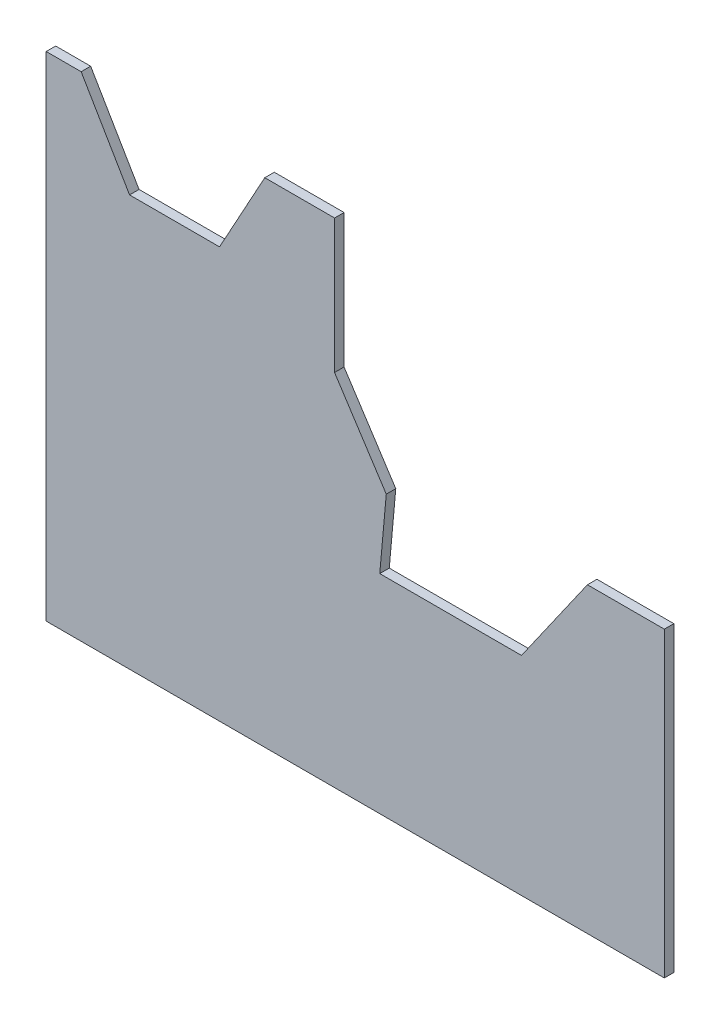
ISO-10303-21;
HEADER;
FILE_DESCRIPTION(('STEP AP214'),'2;1');
FILE_NAME('part.step','',(''),(''),'','','');
FILE_SCHEMA(('AUTOMOTIVE_DESIGN { 1 0 10303 214 1 1 1 1 }'));
ENDSEC;
DATA;
#1=APPLICATION_CONTEXT('core data for automotive mechanical design processes');
#2=APPLICATION_PROTOCOL_DEFINITION('international standard','automotive_design',2000,#1);
#3=PRODUCT_CONTEXT('',#1,'mechanical');
#4=PRODUCT('Part','Part','',(#3));
#5=PRODUCT_RELATED_PRODUCT_CATEGORY('part','',(#4));
#6=PRODUCT_DEFINITION_FORMATION('','',#4);
#7=PRODUCT_DEFINITION_CONTEXT('part definition',#1,'design');
#8=PRODUCT_DEFINITION('design','',#6,#7);
#9=PRODUCT_DEFINITION_SHAPE('','',#8);
#10=(LENGTH_UNIT() NAMED_UNIT(*) SI_UNIT(.MILLI.,.METRE.));
#11=(NAMED_UNIT(*) PLANE_ANGLE_UNIT() SI_UNIT($,.RADIAN.));
#12=(NAMED_UNIT(*) SI_UNIT($,.STERADIAN.) SOLID_ANGLE_UNIT());
#13=UNCERTAINTY_MEASURE_WITH_UNIT(LENGTH_MEASURE(1.E-05),#10,'distance_accuracy_value','');
#14=(GEOMETRIC_REPRESENTATION_CONTEXT(3) GLOBAL_UNCERTAINTY_ASSIGNED_CONTEXT((#13)) GLOBAL_UNIT_ASSIGNED_CONTEXT((#10,
#11,#12)) REPRESENTATION_CONTEXT('',''));
#15=CARTESIAN_POINT('',(0.,0.,0.));
#16=DIRECTION('',(0.,0.,1.));
#17=DIRECTION('',(1.,0.,0.));
#18=AXIS2_PLACEMENT_3D('',#15,#16,#17);
#19=CARTESIAN_POINT('',(11.279813794132,-8.08298090293379,0.8));
#20=DIRECTION('',(-1.,0.,0.));
#21=DIRECTION('',(0.,-1.,0.));
#22=AXIS2_PLACEMENT_3D('',#19,#20,#21);
#23=PLANE('',#22);
#24=DIRECTION('',(0.,1.,0.));
#25=VECTOR('',#24,1.);
#26=CARTESIAN_POINT('',(11.279813794132,-8.08298090293379,0.));
#27=LINE('',#26,#25);
#28=CARTESIAN_POINT('',(11.279813794132,-33.4999999999999,0.));
#29=VERTEX_POINT('',#28);
#30=CARTESIAN_POINT('',(11.279813794132,-8.08298090293379,0.));
#31=VERTEX_POINT('',#30);
#32=EDGE_CURVE('E165',#29,#31,#27,.T.);
#33=ORIENTED_EDGE('',*,*,#32,.T.);
#34=DIRECTION('',(0.,0.,-1.));
#35=VECTOR('',#34,1.);
#36=CARTESIAN_POINT('',(11.279813794132,-8.08298090293379,0.8));
#37=LINE('',#36,#35);
#38=CARTESIAN_POINT('',(11.279813794132,-8.08298090293379,0.8));
#39=VERTEX_POINT('',#38);
#40=EDGE_CURVE('E11',#39,#31,#37,.T.);
#41=ORIENTED_EDGE('',*,*,#40,.F.);
#42=DIRECTION('',(0.,1.,0.));
#43=VECTOR('',#42,1.);
#44=CARTESIAN_POINT('',(11.279813794132,-8.08298090293379,0.8));
#45=LINE('',#44,#43);
#46=CARTESIAN_POINT('',(11.279813794132,-33.4999999999999,0.8));
#47=VERTEX_POINT('',#46);
#48=EDGE_CURVE('E191',#47,#39,#45,.T.);
#49=ORIENTED_EDGE('',*,*,#48,.F.);
#50=DIRECTION('',(0.,0.,-1.));
#51=VECTOR('',#50,1.);
#52=CARTESIAN_POINT('',(11.279813794132,-33.4999999999999,0.8));
#53=LINE('',#52,#51);
#54=EDGE_CURVE('E161',#47,#29,#53,.T.);
#55=ORIENTED_EDGE('',*,*,#54,.T.);
#56=EDGE_LOOP('',(#33,#41,#49,#55));
#57=FACE_BOUND('',#56,.T.);
#58=ADVANCED_FACE('F33',(#57),#23,.F.);
#59=CARTESIAN_POINT('',(11.279813794132,-8.08298090293379,0.8));
#60=DIRECTION('',(0.,-1.,0.));
#61=DIRECTION('',(0.,0.,-1.));
#62=AXIS2_PLACEMENT_3D('',#59,#60,#61);
#63=PLANE('',#62);
#64=DIRECTION('',(-1.,0.,0.));
#65=VECTOR('',#64,1.);
#66=CARTESIAN_POINT('',(11.279813794132,-8.08298090293379,0.));
#67=LINE('',#66,#65);
#68=CARTESIAN_POINT('',(4.81300376005132,-8.08298090293379,0.));
#69=VERTEX_POINT('',#68);
#70=EDGE_CURVE('E168',#31,#69,#67,.T.);
#71=ORIENTED_EDGE('',*,*,#70,.T.);
#72=DIRECTION('',(0.,0.,-1.));
#73=VECTOR('',#72,1.);
#74=CARTESIAN_POINT('',(4.81300376005132,-8.08298090293379,0.8));
#75=LINE('',#74,#73);
#76=CARTESIAN_POINT('',(4.81300376005132,-8.08298090293379,0.8));
#77=VERTEX_POINT('',#76);
#78=EDGE_CURVE('E41',#77,#69,#75,.T.);
#79=ORIENTED_EDGE('',*,*,#78,.F.);
#80=DIRECTION('',(-1.,0.,0.));
#81=VECTOR('',#80,1.);
#82=CARTESIAN_POINT('',(11.279813794132,-8.08298090293379,0.8));
#83=LINE('',#82,#81);
#84=EDGE_CURVE('E110',#39,#77,#83,.T.);
#85=ORIENTED_EDGE('',*,*,#84,.F.);
#86=ORIENTED_EDGE('',*,*,#40,.T.);
#87=EDGE_LOOP('',(#71,#79,#85,#86));
#88=FACE_BOUND('',#87,.T.);
#89=ADVANCED_FACE('F279',(#88),#63,.F.);
#90=CARTESIAN_POINT('',(4.81300376005132,-8.08298090293379,0.8));
#91=DIRECTION('',(0.819152044288993,-0.573576436351044,0.));
#92=DIRECTION('',(0.573576436351044,0.819152044288993,0.));
#93=AXIS2_PLACEMENT_3D('',#90,#91,#92);
#94=PLANE('',#93);
#95=DIRECTION('',(-0.573576436351044,-0.819152044288993,0.));
#96=VECTOR('',#95,1.);
#97=CARTESIAN_POINT('',(4.81300376005132,-8.08298090293379,0.));
#98=LINE('',#97,#96);
#99=CARTESIAN_POINT('',(-0.734771551991552,-16.006025156681,0.));
#100=VERTEX_POINT('',#99);
#101=EDGE_CURVE('E170',#69,#100,#98,.T.);
#102=ORIENTED_EDGE('',*,*,#101,.T.);
#103=DIRECTION('',(0.,0.,-1.));
#104=VECTOR('',#103,1.);
#105=CARTESIAN_POINT('',(-0.734771551991552,-16.006025156681,0.8));
#106=LINE('',#105,#104);
#107=CARTESIAN_POINT('',(-0.734771551991552,-16.006025156681,0.8));
#108=VERTEX_POINT('',#107);
#109=EDGE_CURVE('E216',#108,#100,#106,.T.);
#110=ORIENTED_EDGE('',*,*,#109,.F.);
#111=DIRECTION('',(-0.573576436351044,-0.819152044288993,0.));
#112=VECTOR('',#111,1.);
#113=CARTESIAN_POINT('',(4.81300376005132,-8.08298090293379,0.8));
#114=LINE('',#113,#112);
#115=EDGE_CURVE('E224',#77,#108,#114,.T.);
#116=ORIENTED_EDGE('',*,*,#115,.F.);
#117=ORIENTED_EDGE('',*,*,#78,.T.);
#118=EDGE_LOOP('',(#102,#110,#116,#117));
#119=FACE_BOUND('',#118,.T.);
#120=ADVANCED_FACE('F222',(#119),#94,.F.);
#121=CARTESIAN_POINT('',(-0.734771551991552,-16.006025156681,0.8));
#122=DIRECTION('',(0.,-1.,0.));
#123=DIRECTION('',(0.,0.,-1.));
#124=AXIS2_PLACEMENT_3D('',#121,#122,#123);
#125=PLANE('',#124);
#126=DIRECTION('',(-1.,0.,0.));
#127=VECTOR('',#126,1.);
#128=CARTESIAN_POINT('',(-0.734771551991552,-16.006025156681,0.));
#129=LINE('',#128,#127);
#130=CARTESIAN_POINT('',(-12.65766773392,-16.006025156681,0.));
#131=VERTEX_POINT('',#130);
#132=EDGE_CURVE('E172',#100,#131,#129,.T.);
#133=ORIENTED_EDGE('',*,*,#132,.T.);
#134=DIRECTION('',(0.,0.,-1.));
#135=VECTOR('',#134,1.);
#136=CARTESIAN_POINT('',(-12.65766773392,-16.006025156681,0.8));
#137=LINE('',#136,#135);
#138=CARTESIAN_POINT('',(-12.65766773392,-16.006025156681,0.8));
#139=VERTEX_POINT('',#138);
#140=EDGE_CURVE('E213',#139,#131,#137,.T.);
#141=ORIENTED_EDGE('',*,*,#140,.F.);
#142=DIRECTION('',(-1.,0.,0.));
#143=VECTOR('',#142,1.);
#144=CARTESIAN_POINT('',(-0.734771551991552,-16.006025156681,0.8));
#145=LINE('',#144,#143);
#146=EDGE_CURVE('E242',#108,#139,#145,.T.);
#147=ORIENTED_EDGE('',*,*,#146,.F.);
#148=ORIENTED_EDGE('',*,*,#109,.T.);
#149=EDGE_LOOP('',(#133,#141,#147,#148));
#150=FACE_BOUND('',#149,.T.);
#151=ADVANCED_FACE('F233',(#150),#125,.F.);
#152=CARTESIAN_POINT('',(-12.65766773392,-16.006025156681,0.8));
#153=DIRECTION('',(-0.995953430498841,0.0898708199450178,0.));
#154=DIRECTION('',(-0.0898708199450178,-0.995953430498841,0.));
#155=AXIS2_PLACEMENT_3D('',#152,#153,#154);
#156=PLANE('',#155);
#157=DIRECTION('',(0.0898708199450178,0.995953430498841,0.));
#158=VECTOR('',#157,1.);
#159=CARTESIAN_POINT('',(-12.65766773392,-16.006025156681,0.));
#160=LINE('',#159,#158);
#161=CARTESIAN_POINT('',(-12.1107283955804,-9.94481295646505,0.));
#162=VERTEX_POINT('',#161);
#163=EDGE_CURVE('E174',#131,#162,#160,.T.);
#164=ORIENTED_EDGE('',*,*,#163,.T.);
#165=DIRECTION('',(0.,0.,-1.));
#166=VECTOR('',#165,1.);
#167=CARTESIAN_POINT('',(-12.1107283955804,-9.94481295646505,0.8));
#168=LINE('',#167,#166);
#169=CARTESIAN_POINT('',(-12.1107283955804,-9.94481295646505,0.8));
#170=VERTEX_POINT('',#169);
#171=EDGE_CURVE('E210',#170,#162,#168,.T.);
#172=ORIENTED_EDGE('',*,*,#171,.F.);
#173=DIRECTION('',(0.0898708199450178,0.995953430498841,0.));
#174=VECTOR('',#173,1.);
#175=CARTESIAN_POINT('',(-12.65766773392,-16.006025156681,0.8));
#176=LINE('',#175,#174);
#177=EDGE_CURVE('E239',#139,#170,#176,.T.);
#178=ORIENTED_EDGE('',*,*,#177,.F.);
#179=ORIENTED_EDGE('',*,*,#140,.T.);
#180=EDGE_LOOP('',(#164,#172,#178,#179));
#181=FACE_BOUND('',#180,.T.);
#182=ADVANCED_FACE('F237',(#181),#156,.F.);
#183=CARTESIAN_POINT('',(-12.1107283955804,-9.94481295646505,0.8));
#184=DIRECTION('',(-0.838396358507799,-0.5450610479945,0.));
#185=DIRECTION('',(0.5450610479945,-0.838396358507799,0.));
#186=AXIS2_PLACEMENT_3D('',#183,#184,#185);
#187=PLANE('',#186);
#188=DIRECTION('',(-0.5450610479945,0.838396358507799,0.));
#189=VECTOR('',#188,1.);
#190=CARTESIAN_POINT('',(-12.1107283955804,-9.94481295646505,0.));
#191=LINE('',#190,#189);
#192=CARTESIAN_POINT('',(-16.4603449286848,-3.25436483936376,0.));
#193=VERTEX_POINT('',#192);
#194=EDGE_CURVE('E176',#162,#193,#191,.T.);
#195=ORIENTED_EDGE('',*,*,#194,.T.);
#196=DIRECTION('',(0.,0.,-1.));
#197=VECTOR('',#196,1.);
#198=CARTESIAN_POINT('',(-16.4603449286848,-3.25436483936376,0.8));
#199=LINE('',#198,#197);
#200=CARTESIAN_POINT('',(-16.4603449286848,-3.25436483936376,0.8));
#201=VERTEX_POINT('',#200);
#202=EDGE_CURVE('E207',#201,#193,#199,.T.);
#203=ORIENTED_EDGE('',*,*,#202,.F.);
#204=DIRECTION('',(-0.5450610479945,0.838396358507799,0.));
#205=VECTOR('',#204,1.);
#206=CARTESIAN_POINT('',(-12.1107283955804,-9.94481295646505,0.8));
#207=LINE('',#206,#205);
#208=EDGE_CURVE('E241',#170,#201,#207,.T.);
#209=ORIENTED_EDGE('',*,*,#208,.F.);
#210=ORIENTED_EDGE('',*,*,#171,.T.);
#211=EDGE_LOOP('',(#195,#203,#209,#210));
#212=FACE_BOUND('',#211,.T.);
#213=ADVANCED_FACE('F292',(#212),#187,.F.);
#214=CARTESIAN_POINT('',(-16.4603449286848,-3.25436483936376,0.8));
#215=DIRECTION('',(-1.,0.,0.));
#216=DIRECTION('',(0.,0.,1.));
#217=AXIS2_PLACEMENT_3D('',#214,#215,#216);
#218=PLANE('',#217);
#219=DIRECTION('',(0.,1.,0.));
#220=VECTOR('',#219,1.);
#221=CARTESIAN_POINT('',(-16.4603449286848,-3.25436483936376,0.));
#222=LINE('',#221,#220);
#223=CARTESIAN_POINT('',(-16.4603449286848,8.00075560650966,0.));
#224=VERTEX_POINT('',#223);
#225=EDGE_CURVE('E178',#193,#224,#222,.T.);
#226=ORIENTED_EDGE('',*,*,#225,.T.);
#227=DIRECTION('',(0.,0.,-1.));
#228=VECTOR('',#227,1.);
#229=CARTESIAN_POINT('',(-16.4603449286848,8.00075560650966,0.8));
#230=LINE('',#229,#228);
#231=CARTESIAN_POINT('',(-16.4603449286848,8.00075560650966,0.8));
#232=VERTEX_POINT('',#231);
#233=EDGE_CURVE('E204',#232,#224,#230,.T.);
#234=ORIENTED_EDGE('',*,*,#233,.F.);
#235=DIRECTION('',(0.,1.,0.));
#236=VECTOR('',#235,1.);
#237=CARTESIAN_POINT('',(-16.4603449286848,-3.25436483936376,0.8));
#238=LINE('',#237,#236);
#239=EDGE_CURVE('E244',#201,#232,#238,.T.);
#240=ORIENTED_EDGE('',*,*,#239,.F.);
#241=ORIENTED_EDGE('',*,*,#202,.T.);
#242=EDGE_LOOP('',(#226,#234,#240,#241));
#243=FACE_BOUND('',#242,.T.);
#244=ADVANCED_FACE('F295',(#243),#218,.F.);
#245=CARTESIAN_POINT('',(-16.4603449286848,8.00075560650966,0.8));
#246=DIRECTION('',(0.,-1.,0.));
#247=DIRECTION('',(0.,0.,-1.));
#248=AXIS2_PLACEMENT_3D('',#245,#246,#247);
#249=PLANE('',#248);
#250=DIRECTION('',(-1.,0.,0.));
#251=VECTOR('',#250,1.);
#252=CARTESIAN_POINT('',(-16.4603449286848,8.00075560650966,0.));
#253=LINE('',#252,#251);
#254=CARTESIAN_POINT('',(-22.3305238409462,8.00075560650966,0.));
#255=VERTEX_POINT('',#254);
#256=EDGE_CURVE('E180',#224,#255,#253,.T.);
#257=ORIENTED_EDGE('',*,*,#256,.T.);
#258=DIRECTION('',(0.,0.,-1.));
#259=VECTOR('',#258,1.);
#260=CARTESIAN_POINT('',(-22.3305238409462,8.00075560650966,0.8));
#261=LINE('',#260,#259);
#262=CARTESIAN_POINT('',(-22.3305238409462,8.00075560650966,0.8));
#263=VERTEX_POINT('',#262);
#264=EDGE_CURVE('E201',#263,#255,#261,.T.);
#265=ORIENTED_EDGE('',*,*,#264,.F.);
#266=DIRECTION('',(-1.,0.,0.));
#267=VECTOR('',#266,1.);
#268=CARTESIAN_POINT('',(-16.4603449286848,8.00075560650966,0.8));
#269=LINE('',#268,#267);
#270=EDGE_CURVE('E250',#232,#263,#269,.T.);
#271=ORIENTED_EDGE('',*,*,#270,.F.);
#272=ORIENTED_EDGE('',*,*,#233,.T.);
#273=EDGE_LOOP('',(#257,#265,#271,#272));
#274=FACE_BOUND('',#273,.T.);
#275=ADVANCED_FACE('F299',(#274),#249,.F.);
#276=CARTESIAN_POINT('',(-22.3305238409462,8.00075560650966,0.8));
#277=DIRECTION('',(0.876858448183733,-0.480748647266757,0.));
#278=DIRECTION('',(0.480748647266757,0.876858448183733,0.));
#279=AXIS2_PLACEMENT_3D('',#276,#277,#278);
#280=PLANE('',#279);
#281=DIRECTION('',(-0.480748647266757,-0.876858448183733,0.));
#282=VECTOR('',#281,1.);
#283=CARTESIAN_POINT('',(-22.3305238409462,8.00075560650966,0.));
#284=LINE('',#283,#282);
#285=CARTESIAN_POINT('',(-26.1366473013426,1.05860084423724,0.));
#286=VERTEX_POINT('',#285);
#287=EDGE_CURVE('E182',#255,#286,#284,.T.);
#288=ORIENTED_EDGE('',*,*,#287,.T.);
#289=DIRECTION('',(0.,0.,-1.));
#290=VECTOR('',#289,1.);
#291=CARTESIAN_POINT('',(-26.1366473013426,1.05860084423724,0.8));
#292=LINE('',#291,#290);
#293=CARTESIAN_POINT('',(-26.1366473013426,1.05860084423724,0.8));
#294=VERTEX_POINT('',#293);
#295=EDGE_CURVE('E198',#294,#286,#292,.T.);
#296=ORIENTED_EDGE('',*,*,#295,.F.);
#297=DIRECTION('',(-0.480748647266757,-0.876858448183733,0.));
#298=VECTOR('',#297,1.);
#299=CARTESIAN_POINT('',(-22.3305238409462,8.00075560650966,0.8));
#300=LINE('',#299,#298);
#301=EDGE_CURVE('E252',#263,#294,#300,.T.);
#302=ORIENTED_EDGE('',*,*,#301,.F.);
#303=ORIENTED_EDGE('',*,*,#264,.T.);
#304=EDGE_LOOP('',(#288,#296,#302,#303));
#305=FACE_BOUND('',#304,.T.);
#306=ADVANCED_FACE('F303',(#305),#280,.F.);
#307=CARTESIAN_POINT('',(-26.1366473013426,1.05860084423724,0.8));
#308=DIRECTION('',(0.,-1.,0.));
#309=DIRECTION('',(0.,0.,-1.));
#310=AXIS2_PLACEMENT_3D('',#307,#308,#309);
#311=PLANE('',#310);
#312=DIRECTION('',(-1.,0.,0.));
#313=VECTOR('',#312,1.);
#314=CARTESIAN_POINT('',(-26.1366473013426,1.05860084423724,0.));
#315=LINE('',#314,#313);
#316=CARTESIAN_POINT('',(-33.7070275728679,1.05860084423724,0.));
#317=VERTEX_POINT('',#316);
#318=EDGE_CURVE('E184',#286,#317,#315,.T.);
#319=ORIENTED_EDGE('',*,*,#318,.T.);
#320=DIRECTION('',(0.,0.,-1.));
#321=VECTOR('',#320,1.);
#322=CARTESIAN_POINT('',(-33.7070275728679,1.05860084423724,0.8));
#323=LINE('',#322,#321);
#324=CARTESIAN_POINT('',(-33.7070275728679,1.05860084423724,0.8));
#325=VERTEX_POINT('',#324);
#326=EDGE_CURVE('E195',#325,#317,#323,.T.);
#327=ORIENTED_EDGE('',*,*,#326,.F.);
#328=DIRECTION('',(-1.,0.,0.));
#329=VECTOR('',#328,1.);
#330=CARTESIAN_POINT('',(-26.1366473013426,1.05860084423724,0.8));
#331=LINE('',#330,#329);
#332=EDGE_CURVE('E254',#294,#325,#331,.T.);
#333=ORIENTED_EDGE('',*,*,#332,.F.);
#334=ORIENTED_EDGE('',*,*,#295,.T.);
#335=EDGE_LOOP('',(#319,#327,#333,#334));
#336=FACE_BOUND('',#335,.T.);
#337=ADVANCED_FACE('F260',(#336),#311,.F.);
#338=CARTESIAN_POINT('',(-33.7070275728679,1.05860084423724,0.8));
#339=DIRECTION('',(-0.862574753463412,-0.505929634126658,0.));
#340=DIRECTION('',(0.505929634126658,-0.862574753463412,0.));
#341=AXIS2_PLACEMENT_3D('',#338,#339,#340);
#342=PLANE('',#341);
#343=DIRECTION('',(-0.505929634126658,0.862574753463412,0.));
#344=VECTOR('',#343,1.);
#345=CARTESIAN_POINT('',(-33.7070275728679,1.05860084423724,0.));
#346=LINE('',#345,#344);
#347=CARTESIAN_POINT('',(-37.7788390939271,8.00075560650966,0.));
#348=VERTEX_POINT('',#347);
#349=EDGE_CURVE('E186',#317,#348,#346,.T.);
#350=ORIENTED_EDGE('',*,*,#349,.T.);
#351=DIRECTION('',(0.,0.,-1.));
#352=VECTOR('',#351,1.);
#353=CARTESIAN_POINT('',(-37.7788390939271,8.00075560650966,0.8));
#354=LINE('',#353,#352);
#355=CARTESIAN_POINT('',(-37.7788390939271,8.00075560650966,0.8));
#356=VERTEX_POINT('',#355);
#357=EDGE_CURVE('E156',#356,#348,#354,.T.);
#358=ORIENTED_EDGE('',*,*,#357,.F.);
#359=DIRECTION('',(-0.505929634126658,0.862574753463412,0.));
#360=VECTOR('',#359,1.);
#361=CARTESIAN_POINT('',(-33.7070275728679,1.05860084423724,0.8));
#362=LINE('',#361,#360);
#363=EDGE_CURVE('E147',#325,#356,#362,.T.);
#364=ORIENTED_EDGE('',*,*,#363,.F.);
#365=ORIENTED_EDGE('',*,*,#326,.T.);
#366=EDGE_LOOP('',(#350,#358,#364,#365));
#367=FACE_BOUND('',#366,.T.);
#368=ADVANCED_FACE('F264',(#367),#342,.F.);
#369=CARTESIAN_POINT('',(-37.7788390939271,8.00075560650966,0.8));
#370=DIRECTION('',(0.,-1.,0.));
#371=DIRECTION('',(0.,0.,-1.));
#372=AXIS2_PLACEMENT_3D('',#369,#370,#371);
#373=PLANE('',#372);
#374=DIRECTION('',(-1.,0.,0.));
#375=VECTOR('',#374,1.);
#376=CARTESIAN_POINT('',(-37.7788390939271,8.00075560650966,0.));
#377=LINE('',#376,#375);
#378=CARTESIAN_POINT('',(-40.720186205868,8.00075560650966,0.));
#379=VERTEX_POINT('',#378);
#380=EDGE_CURVE('E155',#348,#379,#377,.T.);
#381=ORIENTED_EDGE('',*,*,#380,.T.);
#382=DIRECTION('',(0.,0.,-1.));
#383=VECTOR('',#382,1.);
#384=CARTESIAN_POINT('',(-40.720186205868,8.00075560650966,0.8));
#385=LINE('',#384,#383);
#386=CARTESIAN_POINT('',(-40.720186205868,8.00075560650966,0.8));
#387=VERTEX_POINT('',#386);
#388=EDGE_CURVE('E152',#387,#379,#385,.T.);
#389=ORIENTED_EDGE('',*,*,#388,.F.);
#390=DIRECTION('',(-1.,0.,0.));
#391=VECTOR('',#390,1.);
#392=CARTESIAN_POINT('',(-37.7788390939271,8.00075560650966,0.8));
#393=LINE('',#392,#391);
#394=EDGE_CURVE('E141',#356,#387,#393,.T.);
#395=ORIENTED_EDGE('',*,*,#394,.F.);
#396=ORIENTED_EDGE('',*,*,#357,.T.);
#397=EDGE_LOOP('',(#381,#389,#395,#396));
#398=FACE_BOUND('',#397,.T.);
#399=ADVANCED_FACE('F153',(#398),#373,.F.);
#400=CARTESIAN_POINT('',(-40.720186205868,8.00075560650966,0.8));
#401=DIRECTION('',(1.,0.,0.));
#402=DIRECTION('',(0.,1.,0.));
#403=AXIS2_PLACEMENT_3D('',#400,#401,#402);
#404=PLANE('',#403);
#405=DIRECTION('',(0.,-1.,0.));
#406=VECTOR('',#405,1.);
#407=CARTESIAN_POINT('',(-40.720186205868,8.00075560650966,0.));
#408=LINE('',#407,#406);
#409=CARTESIAN_POINT('',(-40.720186205868,-33.4999999999999,0.));
#410=VERTEX_POINT('',#409);
#411=EDGE_CURVE('E96',#379,#410,#408,.T.);
#412=ORIENTED_EDGE('',*,*,#411,.T.);
#413=DIRECTION('',(0.,0.,-1.));
#414=VECTOR('',#413,1.);
#415=CARTESIAN_POINT('',(-40.720186205868,-33.4999999999999,0.8));
#416=LINE('',#415,#414);
#417=CARTESIAN_POINT('',(-40.720186205868,-33.4999999999999,0.8));
#418=VERTEX_POINT('',#417);
#419=EDGE_CURVE('E157',#418,#410,#416,.T.);
#420=ORIENTED_EDGE('',*,*,#419,.F.);
#421=DIRECTION('',(0.,-1.,0.));
#422=VECTOR('',#421,1.);
#423=CARTESIAN_POINT('',(-40.720186205868,8.00075560650966,0.8));
#424=LINE('',#423,#422);
#425=EDGE_CURVE('E145',#387,#418,#424,.T.);
#426=ORIENTED_EDGE('',*,*,#425,.F.);
#427=ORIENTED_EDGE('',*,*,#388,.T.);
#428=EDGE_LOOP('',(#412,#420,#426,#427));
#429=FACE_BOUND('',#428,.T.);
#430=ADVANCED_FACE('F159',(#429),#404,.F.);
#431=CARTESIAN_POINT('',(-40.720186205868,-33.4999999999999,0.8));
#432=DIRECTION('',(0.,1.,0.));
#433=DIRECTION('',(0.,0.,1.));
#434=AXIS2_PLACEMENT_3D('',#431,#432,#433);
#435=PLANE('',#434);
#436=DIRECTION('',(1.,0.,0.));
#437=VECTOR('',#436,1.);
#438=CARTESIAN_POINT('',(-40.720186205868,-33.4999999999999,0.));
#439=LINE('',#438,#437);
#440=EDGE_CURVE('E102',#410,#29,#439,.T.);
#441=ORIENTED_EDGE('',*,*,#440,.T.);
#442=ORIENTED_EDGE('',*,*,#54,.F.);
#443=DIRECTION('',(1.,0.,0.));
#444=VECTOR('',#443,1.);
#445=CARTESIAN_POINT('',(-40.720186205868,-33.4999999999999,0.8));
#446=LINE('',#445,#444);
#447=EDGE_CURVE('E49',#418,#47,#446,.T.);
#448=ORIENTED_EDGE('',*,*,#447,.F.);
#449=ORIENTED_EDGE('',*,*,#419,.T.);
#450=EDGE_LOOP('',(#441,#442,#448,#449));
#451=FACE_BOUND('',#450,.T.);
#452=ADVANCED_FACE('F268',(#451),#435,.F.);
#453=CARTESIAN_POINT('',(0.,0.,0.8));
#454=DIRECTION('',(0.,0.,1.));
#455=DIRECTION('',(1.,0.,0.));
#456=AXIS2_PLACEMENT_3D('',#453,#454,#455);
#457=PLANE('',#456);
#458=ORIENTED_EDGE('',*,*,#48,.T.);
#459=ORIENTED_EDGE('',*,*,#84,.T.);
#460=ORIENTED_EDGE('',*,*,#115,.T.);
#461=ORIENTED_EDGE('',*,*,#146,.T.);
#462=ORIENTED_EDGE('',*,*,#177,.T.);
#463=ORIENTED_EDGE('',*,*,#208,.T.);
#464=ORIENTED_EDGE('',*,*,#239,.T.);
#465=ORIENTED_EDGE('',*,*,#270,.T.);
#466=ORIENTED_EDGE('',*,*,#301,.T.);
#467=ORIENTED_EDGE('',*,*,#332,.T.);
#468=ORIENTED_EDGE('',*,*,#363,.T.);
#469=ORIENTED_EDGE('',*,*,#394,.T.);
#470=ORIENTED_EDGE('',*,*,#425,.T.);
#471=ORIENTED_EDGE('',*,*,#447,.T.);
#472=EDGE_LOOP('',(#458,#459,#460,#461,#462,#463,#464,#465,#466,#467,#468,#469,#470,#471));
#473=FACE_BOUND('',#472,.T.);
#474=ADVANCED_FACE('F143',(#473),#457,.T.);
#475=CARTESIAN_POINT('',(0.,0.,0.));
#476=DIRECTION('',(0.,0.,1.));
#477=DIRECTION('',(1.,0.,0.));
#478=AXIS2_PLACEMENT_3D('',#475,#476,#477);
#479=PLANE('',#478);
#480=ORIENTED_EDGE('',*,*,#32,.F.);
#481=ORIENTED_EDGE('',*,*,#440,.F.);
#482=ORIENTED_EDGE('',*,*,#411,.F.);
#483=ORIENTED_EDGE('',*,*,#380,.F.);
#484=ORIENTED_EDGE('',*,*,#349,.F.);
#485=ORIENTED_EDGE('',*,*,#318,.F.);
#486=ORIENTED_EDGE('',*,*,#287,.F.);
#487=ORIENTED_EDGE('',*,*,#256,.F.);
#488=ORIENTED_EDGE('',*,*,#225,.F.);
#489=ORIENTED_EDGE('',*,*,#194,.F.);
#490=ORIENTED_EDGE('',*,*,#163,.F.);
#491=ORIENTED_EDGE('',*,*,#132,.F.);
#492=ORIENTED_EDGE('',*,*,#101,.F.);
#493=ORIENTED_EDGE('',*,*,#70,.F.);
#494=EDGE_LOOP('',(#480,#481,#482,#483,#484,#485,#486,#487,#488,#489,#490,#491,#492,#493));
#495=FACE_BOUND('',#494,.T.);
#496=ADVANCED_FACE('F228',(#495),#479,.F.);
#497=CLOSED_SHELL('',(#58,#89,#120,#151,#182,#213,#244,#275,#306,#337,#368,#399,#430,#452,#474,#496));
#498=MANIFOLD_SOLID_BREP('B2',#497);
#499=ADVANCED_BREP_SHAPE_REPRESENTATION('',(#18,#498),#14);
#500=SHAPE_DEFINITION_REPRESENTATION(#9,#499);
ENDSEC;
END-ISO-10303-21;
